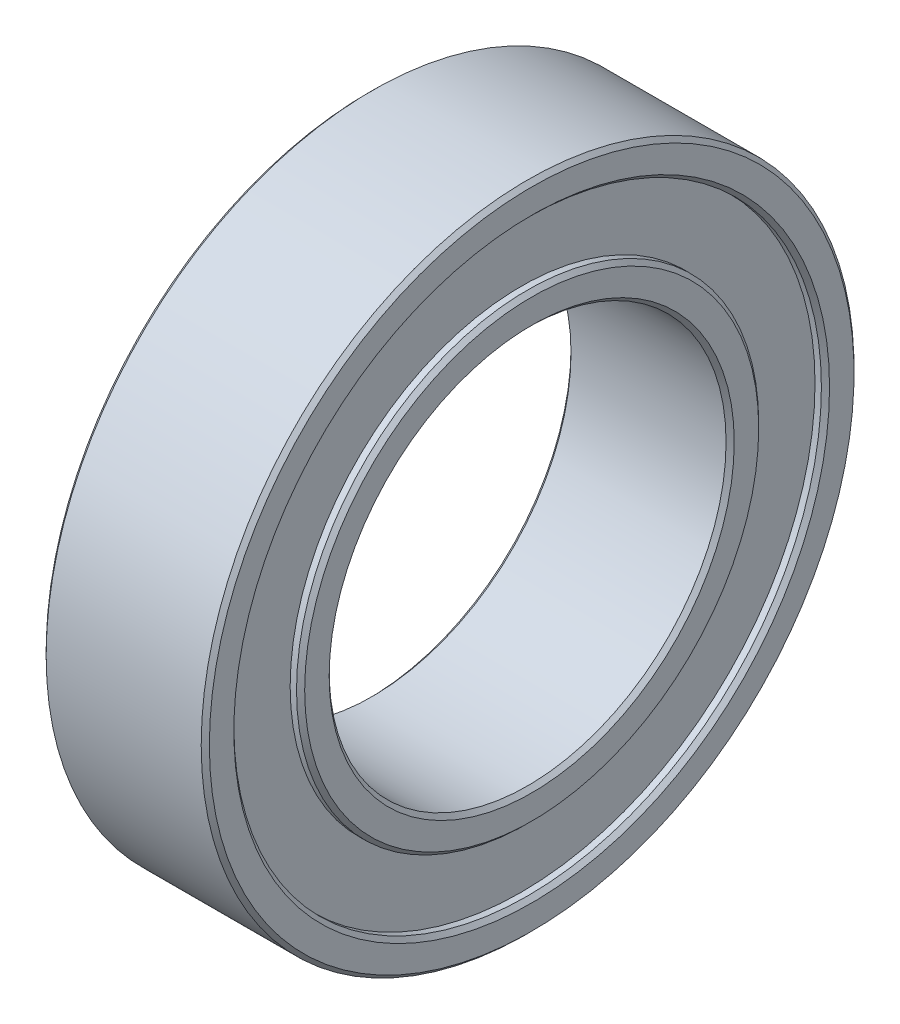
ISO-10303-21;
HEADER;
FILE_DESCRIPTION(('STEP AP214'),'2;1');
FILE_NAME('part.step','',(''),(''),'','','');
FILE_SCHEMA(('AUTOMOTIVE_DESIGN { 1 0 10303 214 1 1 1 1 }'));
ENDSEC;
DATA;
#1=APPLICATION_CONTEXT('core data for automotive mechanical design processes');
#2=APPLICATION_PROTOCOL_DEFINITION('international standard','automotive_design',2000,#1);
#3=PRODUCT_CONTEXT('',#1,'mechanical');
#4=PRODUCT('Part','Part','',(#3));
#5=PRODUCT_RELATED_PRODUCT_CATEGORY('part','',(#4));
#6=PRODUCT_DEFINITION_FORMATION('','',#4);
#7=PRODUCT_DEFINITION_CONTEXT('part definition',#1,'design');
#8=PRODUCT_DEFINITION('design','',#6,#7);
#9=PRODUCT_DEFINITION_SHAPE('','',#8);
#10=(LENGTH_UNIT() NAMED_UNIT(*) SI_UNIT(.MILLI.,.METRE.));
#11=(NAMED_UNIT(*) PLANE_ANGLE_UNIT() SI_UNIT($,.RADIAN.));
#12=(NAMED_UNIT(*) SI_UNIT($,.STERADIAN.) SOLID_ANGLE_UNIT());
#13=UNCERTAINTY_MEASURE_WITH_UNIT(LENGTH_MEASURE(1.E-05),#10,'distance_accuracy_value','');
#14=(GEOMETRIC_REPRESENTATION_CONTEXT(3) GLOBAL_UNCERTAINTY_ASSIGNED_CONTEXT((#13)) GLOBAL_UNIT_ASSIGNED_CONTEXT((#10,
#11,#12)) REPRESENTATION_CONTEXT('',''));
#15=CARTESIAN_POINT('',(0.,0.,0.));
#16=DIRECTION('',(0.,0.,1.));
#17=DIRECTION('',(1.,0.,0.));
#18=AXIS2_PLACEMENT_3D('',#15,#16,#17);
#19=CARTESIAN_POINT('',(1.984375,0.,0.));
#20=DIRECTION('',(-1.,0.,0.));
#21=DIRECTION('',(0.,0.,1.));
#22=AXIS2_PLACEMENT_3D('',#19,#20,#21);
#23=CYLINDRICAL_SURFACE('',#22,5.61975);
#24=CARTESIAN_POINT('',(-1.984375,0.,0.));
#25=DIRECTION('',(1.,0.,0.));
#26=DIRECTION('',(0.,0.,-1.));
#27=AXIS2_PLACEMENT_3D('',#24,#25,#26);
#28=CIRCLE('',#27,5.61975);
#29=CARTESIAN_POINT('',(-1.984375,0.,-5.61975));
#30=VERTEX_POINT('',#29);
#31=EDGE_CURVE('E99',#30,#30,#28,.T.);
#32=ORIENTED_EDGE('',*,*,#31,.T.);
#33=EDGE_LOOP('',(#32));
#34=FACE_BOUND('',#33,.T.);
#35=CARTESIAN_POINT('',(-1.730375,0.,0.));
#36=DIRECTION('',(1.,0.,0.));
#37=DIRECTION('',(0.,0.,-1.));
#38=AXIS2_PLACEMENT_3D('',#35,#36,#37);
#39=CIRCLE('',#38,5.61975);
#40=CARTESIAN_POINT('',(-1.730375,0.,-5.61975));
#41=VERTEX_POINT('',#40);
#42=EDGE_CURVE('E96',#41,#41,#39,.T.);
#43=ORIENTED_EDGE('',*,*,#42,.F.);
#44=EDGE_LOOP('',(#43));
#45=FACE_BOUND('',#44,.T.);
#46=ADVANCED_FACE('F51',(#34,#45),#23,.T.);
#47=CARTESIAN_POINT('',(1.984375,0.,0.));
#48=DIRECTION('',(-1.,0.,0.));
#49=DIRECTION('',(0.,0.,1.));
#50=AXIS2_PLACEMENT_3D('',#47,#48,#49);
#51=CYLINDRICAL_SURFACE('',#50,4.826);
#52=CARTESIAN_POINT('',(-1.88515625,0.,0.));
#53=DIRECTION('',(1.,0.,0.));
#54=DIRECTION('',(0.,0.,-1.));
#55=AXIS2_PLACEMENT_3D('',#52,#53,#54);
#56=CIRCLE('',#55,4.826);
#57=CARTESIAN_POINT('',(-1.88515625,0.,-4.826));
#58=VERTEX_POINT('',#57);
#59=EDGE_CURVE('E87',#58,#58,#56,.F.);
#60=ORIENTED_EDGE('',*,*,#59,.T.);
#61=EDGE_LOOP('',(#60));
#62=FACE_BOUND('',#61,.T.);
#63=CARTESIAN_POINT('',(1.88515625,0.,0.));
#64=DIRECTION('',(1.,0.,0.));
#65=DIRECTION('',(0.,0.,-1.));
#66=AXIS2_PLACEMENT_3D('',#63,#64,#65);
#67=CIRCLE('',#66,4.826);
#68=CARTESIAN_POINT('',(1.88515625,0.,-4.826));
#69=VERTEX_POINT('',#68);
#70=EDGE_CURVE('E90',#69,#69,#67,.T.);
#71=ORIENTED_EDGE('',*,*,#70,.T.);
#72=EDGE_LOOP('',(#71));
#73=FACE_BOUND('',#72,.T.);
#74=ADVANCED_FACE('F132',(#62,#73),#51,.F.);
#75=CARTESIAN_POINT('',(1.88515625,0.,0.));
#76=DIRECTION('',(1.,0.,0.));
#77=DIRECTION('',(0.,0.,-1.));
#78=AXIS2_PLACEMENT_3D('',#75,#76,#77);
#79=CIRCLE('',#78,5.61975);
#80=CARTESIAN_POINT('',(1.88515625,0.,-5.61975));
#81=VERTEX_POINT('',#80);
#82=EDGE_CURVE('E11',#81,#81,#79,.F.);
#83=ORIENTED_EDGE('',*,*,#82,.T.);
#84=EDGE_LOOP('',(#83));
#85=FACE_BOUND('',#84,.T.);
#86=CARTESIAN_POINT('',(1.730375,0.,0.));
#87=DIRECTION('',(1.,0.,0.));
#88=DIRECTION('',(0.,0.,-1.));
#89=AXIS2_PLACEMENT_3D('',#86,#87,#88);
#90=CIRCLE('',#89,5.61975);
#91=CARTESIAN_POINT('',(1.730375,0.,-5.61975));
#92=VERTEX_POINT('',#91);
#93=EDGE_CURVE('E105',#92,#92,#90,.T.);
#94=ORIENTED_EDGE('',*,*,#93,.T.);
#95=EDGE_LOOP('',(#94));
#96=FACE_BOUND('',#95,.T.);
#97=ADVANCED_FACE('F135',(#85,#96),#23,.T.);
#98=CARTESIAN_POINT('',(1.984375,0.,0.));
#99=DIRECTION('',(1.,0.,0.));
#100=DIRECTION('',(0.,0.,-1.));
#101=AXIS2_PLACEMENT_3D('',#98,#99,#100);
#102=PLANE('',#101);
#103=CARTESIAN_POINT('',(1.984375,0.,0.));
#104=DIRECTION('',(1.,0.,0.));
#105=DIRECTION('',(0.,0.,-1.));
#106=AXIS2_PLACEMENT_3D('',#103,#104,#105);
#107=CIRCLE('',#106,4.92521875);
#108=CARTESIAN_POINT('',(1.984375,0.,-4.92521875));
#109=VERTEX_POINT('',#108);
#110=EDGE_CURVE('E81',#109,#109,#107,.F.);
#111=ORIENTED_EDGE('',*,*,#110,.T.);
#112=EDGE_LOOP('',(#111));
#113=FACE_BOUND('',#112,.T.);
#114=CARTESIAN_POINT('',(1.984375,0.,0.));
#115=DIRECTION('',(1.,0.,0.));
#116=DIRECTION('',(0.,0.,-1.));
#117=AXIS2_PLACEMENT_3D('',#114,#115,#116);
#118=CIRCLE('',#117,5.52053125);
#119=CARTESIAN_POINT('',(1.984375,0.,-5.52053125));
#120=VERTEX_POINT('',#119);
#121=EDGE_CURVE('E84',#120,#120,#118,.T.);
#122=ORIENTED_EDGE('',*,*,#121,.T.);
#123=EDGE_LOOP('',(#122));
#124=FACE_BOUND('',#123,.T.);
#125=ADVANCED_FACE('F144',(#113,#124),#102,.T.);
#126=CARTESIAN_POINT('',(-1.984375,0.,0.));
#127=DIRECTION('',(1.,0.,0.));
#128=DIRECTION('',(0.,0.,-1.));
#129=AXIS2_PLACEMENT_3D('',#126,#127,#128);
#130=PLANE('',#129);
#131=CARTESIAN_POINT('',(-1.984375,0.,0.));
#132=DIRECTION('',(1.,0.,0.));
#133=DIRECTION('',(0.,0.,-1.));
#134=AXIS2_PLACEMENT_3D('',#131,#132,#133);
#135=CIRCLE('',#134,4.92521875);
#136=CARTESIAN_POINT('',(-1.984375,0.,-4.92521875));
#137=VERTEX_POINT('',#136);
#138=EDGE_CURVE('E93',#137,#137,#135,.T.);
#139=ORIENTED_EDGE('',*,*,#138,.T.);
#140=EDGE_LOOP('',(#139));
#141=FACE_BOUND('',#140,.T.);
#142=ORIENTED_EDGE('',*,*,#31,.F.);
#143=EDGE_LOOP('',(#142));
#144=FACE_BOUND('',#143,.T.);
#145=ADVANCED_FACE('F148',(#141,#144),#130,.F.);
#146=CARTESIAN_POINT('',(1.730375,0.,0.));
#147=DIRECTION('',(1.,0.,0.));
#148=DIRECTION('',(0.,0.,-1.));
#149=AXIS2_PLACEMENT_3D('',#146,#147,#148);
#150=PLANE('',#149);
#151=CARTESIAN_POINT('',(1.730375,0.,0.));
#152=DIRECTION('',(1.,0.,0.));
#153=DIRECTION('',(0.,0.,-1.));
#154=AXIS2_PLACEMENT_3D('',#151,#152,#153);
#155=CIRCLE('',#154,7.14375);
#156=CARTESIAN_POINT('',(1.730375,0.,-7.14375));
#157=VERTEX_POINT('',#156);
#158=EDGE_CURVE('E108',#157,#157,#155,.F.);
#159=ORIENTED_EDGE('',*,*,#158,.F.);
#160=EDGE_LOOP('',(#159));
#161=FACE_BOUND('',#160,.T.);
#162=ORIENTED_EDGE('',*,*,#93,.F.);
#163=EDGE_LOOP('',(#162));
#164=FACE_BOUND('',#163,.T.);
#165=ADVANCED_FACE('F127',(#161,#164),#150,.T.);
#166=CARTESIAN_POINT('',(-1.730375,0.,0.));
#167=DIRECTION('',(1.,0.,0.));
#168=DIRECTION('',(0.,0.,-1.));
#169=AXIS2_PLACEMENT_3D('',#166,#167,#168);
#170=PLANE('',#169);
#171=CARTESIAN_POINT('',(-1.730375,0.,0.));
#172=DIRECTION('',(1.,0.,0.));
#173=DIRECTION('',(0.,0.,-1.));
#174=AXIS2_PLACEMENT_3D('',#171,#172,#173);
#175=CIRCLE('',#174,7.14375);
#176=CARTESIAN_POINT('',(-1.730375,0.,-7.14375));
#177=VERTEX_POINT('',#176);
#178=EDGE_CURVE('E102',#177,#177,#175,.T.);
#179=ORIENTED_EDGE('',*,*,#178,.F.);
#180=EDGE_LOOP('',(#179));
#181=FACE_BOUND('',#180,.T.);
#182=ORIENTED_EDGE('',*,*,#42,.T.);
#183=EDGE_LOOP('',(#182));
#184=FACE_BOUND('',#183,.T.);
#185=ADVANCED_FACE('F121',(#181,#184),#170,.F.);
#186=CARTESIAN_POINT('',(1.984375,0.,0.));
#187=DIRECTION('',(-1.,0.,0.));
#188=DIRECTION('',(0.,0.,1.));
#189=AXIS2_PLACEMENT_3D('',#186,#187,#188);
#190=CYLINDRICAL_SURFACE('',#189,7.14375);
#191=CARTESIAN_POINT('',(-1.984375,0.,0.));
#192=DIRECTION('',(1.,0.,0.));
#193=DIRECTION('',(0.,0.,-1.));
#194=AXIS2_PLACEMENT_3D('',#191,#192,#193);
#195=CIRCLE('',#194,7.14375);
#196=CARTESIAN_POINT('',(-1.984375,0.,-7.14375));
#197=VERTEX_POINT('',#196);
#198=EDGE_CURVE('E111',#197,#197,#195,.T.);
#199=ORIENTED_EDGE('',*,*,#198,.F.);
#200=EDGE_LOOP('',(#199));
#201=FACE_BOUND('',#200,.T.);
#202=ORIENTED_EDGE('',*,*,#178,.T.);
#203=EDGE_LOOP('',(#202));
#204=FACE_BOUND('',#203,.T.);
#205=ADVANCED_FACE('F117',(#201,#204),#190,.F.);
#206=CARTESIAN_POINT('',(1.88515625,0.,0.));
#207=DIRECTION('',(1.,0.,0.));
#208=DIRECTION('',(0.,0.,-1.));
#209=AXIS2_PLACEMENT_3D('',#206,#207,#208);
#210=CIRCLE('',#209,7.14375);
#211=CARTESIAN_POINT('',(1.88515625,0.,-7.14375));
#212=VERTEX_POINT('',#211);
#213=EDGE_CURVE('E59',#212,#212,#210,.T.);
#214=ORIENTED_EDGE('',*,*,#213,.T.);
#215=EDGE_LOOP('',(#214));
#216=FACE_BOUND('',#215,.T.);
#217=ORIENTED_EDGE('',*,*,#158,.T.);
#218=EDGE_LOOP('',(#217));
#219=FACE_BOUND('',#218,.T.);
#220=ADVANCED_FACE('F120',(#216,#219),#190,.F.);
#221=CARTESIAN_POINT('',(1.984375,0.,0.));
#222=DIRECTION('',(-1.,0.,0.));
#223=DIRECTION('',(0.,0.,1.));
#224=AXIS2_PLACEMENT_3D('',#221,#222,#223);
#225=CYLINDRICAL_SURFACE('',#224,7.9375);
#226=CARTESIAN_POINT('',(-1.88515625,0.,0.));
#227=DIRECTION('',(1.,0.,0.));
#228=DIRECTION('',(0.,0.,-1.));
#229=AXIS2_PLACEMENT_3D('',#226,#227,#228);
#230=CIRCLE('',#229,7.9375);
#231=CARTESIAN_POINT('',(-1.88515625,0.,-7.9375));
#232=VERTEX_POINT('',#231);
#233=EDGE_CURVE('E75',#232,#232,#230,.T.);
#234=ORIENTED_EDGE('',*,*,#233,.T.);
#235=EDGE_LOOP('',(#234));
#236=FACE_BOUND('',#235,.T.);
#237=CARTESIAN_POINT('',(1.88515625000001,0.,0.));
#238=DIRECTION('',(1.,0.,0.));
#239=DIRECTION('',(0.,0.,-1.));
#240=AXIS2_PLACEMENT_3D('',#237,#238,#239);
#241=CIRCLE('',#240,7.9375);
#242=CARTESIAN_POINT('',(1.88515625000001,0.,7.9375));
#243=VERTEX_POINT('',#242);
#244=EDGE_CURVE('E78',#243,#243,#241,.F.);
#245=ORIENTED_EDGE('',*,*,#244,.T.);
#246=EDGE_LOOP('',(#245));
#247=FACE_BOUND('',#246,.T.);
#248=ADVANCED_FACE('F164',(#236,#247),#225,.T.);
#249=CARTESIAN_POINT('',(1.984375,0.,0.));
#250=DIRECTION('',(1.,0.,0.));
#251=DIRECTION('',(0.,0.,-1.));
#252=AXIS2_PLACEMENT_3D('',#249,#250,#251);
#253=PLANE('',#252);
#254=CARTESIAN_POINT('',(1.984375,0.,0.));
#255=DIRECTION('',(1.,0.,0.));
#256=DIRECTION('',(0.,0.,-1.));
#257=AXIS2_PLACEMENT_3D('',#254,#255,#256);
#258=CIRCLE('',#257,7.83828125000001);
#259=CARTESIAN_POINT('',(1.984375,0.,7.83828125000001));
#260=VERTEX_POINT('',#259);
#261=EDGE_CURVE('E63',#260,#260,#258,.T.);
#262=ORIENTED_EDGE('',*,*,#261,.T.);
#263=EDGE_LOOP('',(#262));
#264=FACE_BOUND('',#263,.T.);
#265=CARTESIAN_POINT('',(1.984375,0.,0.));
#266=DIRECTION('',(1.,0.,0.));
#267=DIRECTION('',(0.,0.,-1.));
#268=AXIS2_PLACEMENT_3D('',#265,#266,#267);
#269=CIRCLE('',#268,7.24296875);
#270=CARTESIAN_POINT('',(1.984375,0.,-7.24296875));
#271=VERTEX_POINT('',#270);
#272=EDGE_CURVE('E67',#271,#271,#269,.F.);
#273=ORIENTED_EDGE('',*,*,#272,.T.);
#274=EDGE_LOOP('',(#273));
#275=FACE_BOUND('',#274,.T.);
#276=ADVANCED_FACE('F167',(#264,#275),#253,.T.);
#277=CARTESIAN_POINT('',(-1.984375,0.,0.));
#278=DIRECTION('',(1.,0.,0.));
#279=DIRECTION('',(0.,0.,-1.));
#280=AXIS2_PLACEMENT_3D('',#277,#278,#279);
#281=PLANE('',#280);
#282=CARTESIAN_POINT('',(-1.984375,0.,0.));
#283=DIRECTION('',(1.,0.,0.));
#284=DIRECTION('',(0.,0.,-1.));
#285=AXIS2_PLACEMENT_3D('',#282,#283,#284);
#286=CIRCLE('',#285,7.83828125);
#287=CARTESIAN_POINT('',(-1.984375,0.,-7.83828125));
#288=VERTEX_POINT('',#287);
#289=EDGE_CURVE('E72',#288,#288,#286,.F.);
#290=ORIENTED_EDGE('',*,*,#289,.T.);
#291=EDGE_LOOP('',(#290));
#292=FACE_BOUND('',#291,.T.);
#293=ORIENTED_EDGE('',*,*,#198,.T.);
#294=EDGE_LOOP('',(#293));
#295=FACE_BOUND('',#294,.T.);
#296=ADVANCED_FACE('F115',(#292,#295),#281,.F.);
#297=CARTESIAN_POINT('',(-1.984375,0.,0.));
#298=DIRECTION('',(-1.,0.,0.));
#299=DIRECTION('',(0.,0.,1.));
#300=AXIS2_PLACEMENT_3D('',#297,#298,#299);
#301=CONICAL_SURFACE('',#300,4.92521875,0.785398163397444);
#302=ORIENTED_EDGE('',*,*,#59,.F.);
#303=EDGE_LOOP('',(#302));
#304=FACE_BOUND('',#303,.T.);
#305=ORIENTED_EDGE('',*,*,#138,.F.);
#306=EDGE_LOOP('',(#305));
#307=FACE_BOUND('',#306,.T.);
#308=ADVANCED_FACE('F171',(#304,#307),#301,.F.);
#309=CARTESIAN_POINT('',(1.88515625,0.,0.));
#310=DIRECTION('',(1.,0.,0.));
#311=DIRECTION('',(0.,0.,-1.));
#312=AXIS2_PLACEMENT_3D('',#309,#310,#311);
#313=CONICAL_SURFACE('',#312,4.826,0.785398163397461);
#314=ORIENTED_EDGE('',*,*,#110,.F.);
#315=EDGE_LOOP('',(#314));
#316=FACE_BOUND('',#315,.T.);
#317=ORIENTED_EDGE('',*,*,#70,.F.);
#318=EDGE_LOOP('',(#317));
#319=FACE_BOUND('',#318,.T.);
#320=ADVANCED_FACE('F206',(#316,#319),#313,.F.);
#321=CARTESIAN_POINT('',(-1.88515625,0.,0.));
#322=DIRECTION('',(1.,0.,0.));
#323=DIRECTION('',(0.,0.,-1.));
#324=AXIS2_PLACEMENT_3D('',#321,#322,#323);
#325=CONICAL_SURFACE('',#324,7.9375,0.785398163397448);
#326=ORIENTED_EDGE('',*,*,#289,.F.);
#327=EDGE_LOOP('',(#326));
#328=FACE_BOUND('',#327,.T.);
#329=ORIENTED_EDGE('',*,*,#233,.F.);
#330=EDGE_LOOP('',(#329));
#331=FACE_BOUND('',#330,.T.);
#332=ADVANCED_FACE('F190',(#328,#331),#325,.T.);
#333=CARTESIAN_POINT('',(1.984375,0.,0.));
#334=DIRECTION('',(-1.,0.,0.));
#335=DIRECTION('',(0.,0.,1.));
#336=AXIS2_PLACEMENT_3D('',#333,#334,#335);
#337=CONICAL_SURFACE('',#336,7.83828125000001,0.785398163397448);
#338=CARTESIAN_POINT('',(1.88515625000001,0.,7.9375));
#339=CARTESIAN_POINT('',(1.88618977864584,0.,7.93646647135417));
#340=CARTESIAN_POINT('',(1.88722330729167,0.,7.93543294270833));
#341=CARTESIAN_POINT('',(1.88929036458334,0.,7.93336588541667));
#342=CARTESIAN_POINT('',(1.89032389322917,0.,7.93233235677083));
#343=CARTESIAN_POINT('',(1.89239095052084,0.,7.93026529947917));
#344=CARTESIAN_POINT('',(1.89342447916667,0.,7.92923177083333));
#345=CARTESIAN_POINT('',(1.89549153645834,0.,7.92716471354167));
#346=CARTESIAN_POINT('',(1.89652506510417,0.,7.92613118489583));
#347=CARTESIAN_POINT('',(1.89859212239584,0.,7.92406412760417));
#348=CARTESIAN_POINT('',(1.89962565104167,0.,7.92303059895833));
#349=CARTESIAN_POINT('',(1.90169270833334,0.,7.92096354166667));
#350=CARTESIAN_POINT('',(1.90272623697917,0.,7.91993001302083));
#351=CARTESIAN_POINT('',(1.90479329427084,0.,7.91786295572917));
#352=CARTESIAN_POINT('',(1.90582682291667,0.,7.91682942708333));
#353=CARTESIAN_POINT('',(1.90789388020834,0.,7.91476236979167));
#354=CARTESIAN_POINT('',(1.90892740885417,0.,7.91372884114584));
#355=CARTESIAN_POINT('',(1.91099446614584,0.,7.91166178385417));
#356=CARTESIAN_POINT('',(1.91202799479167,0.,7.91062825520833));
#357=CARTESIAN_POINT('',(1.91409505208334,0.,7.90856119791667));
#358=CARTESIAN_POINT('',(1.91512858072917,0.,7.90752766927083));
#359=CARTESIAN_POINT('',(1.91719563802084,0.,7.90546061197917));
#360=CARTESIAN_POINT('',(1.91822916666667,0.,7.90442708333333));
#361=CARTESIAN_POINT('',(1.92029622395834,0.,7.90236002604167));
#362=CARTESIAN_POINT('',(1.92132975260417,0.,7.90132649739583));
#363=CARTESIAN_POINT('',(1.92339680989584,0.,7.89925944010417));
#364=CARTESIAN_POINT('',(1.92443033854167,0.,7.89822591145834));
#365=CARTESIAN_POINT('',(1.92649739583334,0.,7.89615885416667));
#366=CARTESIAN_POINT('',(1.92753092447917,0.,7.89512532552084));
#367=CARTESIAN_POINT('',(1.92959798177084,0.,7.89305826822917));
#368=CARTESIAN_POINT('',(1.93063151041667,0.,7.89202473958334));
#369=CARTESIAN_POINT('',(1.93269856770834,0.,7.88995768229167));
#370=CARTESIAN_POINT('',(1.93373209635417,0.,7.88892415364584));
#371=CARTESIAN_POINT('',(1.93579915364584,0.,7.88685709635417));
#372=CARTESIAN_POINT('',(1.93683268229167,0.,7.88582356770834));
#373=CARTESIAN_POINT('',(1.93889973958334,0.,7.88375651041667));
#374=CARTESIAN_POINT('',(1.93993326822917,0.,7.88272298177084));
#375=CARTESIAN_POINT('',(1.94200032552084,0.,7.88065592447917));
#376=CARTESIAN_POINT('',(1.94303385416667,0.,7.87962239583334));
#377=CARTESIAN_POINT('',(1.94510091145834,0.,7.87755533854167));
#378=CARTESIAN_POINT('',(1.94613444010417,0.,7.87652180989584));
#379=CARTESIAN_POINT('',(1.94820149739584,0.,7.87445475260417));
#380=CARTESIAN_POINT('',(1.94923502604167,0.,7.87342122395834));
#381=CARTESIAN_POINT('',(1.95130208333333,0.,7.87135416666667));
#382=CARTESIAN_POINT('',(1.95233561197917,0.,7.87032063802084));
#383=CARTESIAN_POINT('',(1.95440266927083,0.,7.86825358072917));
#384=CARTESIAN_POINT('',(1.95543619791667,0.,7.86722005208334));
#385=CARTESIAN_POINT('',(1.95750325520833,0.,7.86515299479167));
#386=CARTESIAN_POINT('',(1.95853678385417,0.,7.86411946614584));
#387=CARTESIAN_POINT('',(1.96060384114583,0.,7.86205240885417));
#388=CARTESIAN_POINT('',(1.96163736979167,0.,7.86101888020834));
#389=CARTESIAN_POINT('',(1.96370442708333,0.,7.85895182291667));
#390=CARTESIAN_POINT('',(1.96473795572917,0.,7.85791829427084));
#391=CARTESIAN_POINT('',(1.96680501302083,0.,7.85585123697917));
#392=CARTESIAN_POINT('',(1.96783854166667,0.,7.85481770833334));
#393=CARTESIAN_POINT('',(1.96990559895833,0.,7.85275065104167));
#394=CARTESIAN_POINT('',(1.97093912760417,0.,7.85171712239584));
#395=CARTESIAN_POINT('',(1.97300618489583,0.,7.84965006510417));
#396=CARTESIAN_POINT('',(1.97403971354167,0.,7.84861653645834));
#397=CARTESIAN_POINT('',(1.97610677083333,0.,7.84654947916667));
#398=CARTESIAN_POINT('',(1.97714029947917,0.,7.84551595052084));
#399=CARTESIAN_POINT('',(1.97920735677083,0.,7.84344889322917));
#400=CARTESIAN_POINT('',(1.98024088541667,0.,7.84241536458334));
#401=CARTESIAN_POINT('',(1.98230794270833,0.,7.84034830729167));
#402=CARTESIAN_POINT('',(1.98334147135417,0.,7.83931477864584));
#403=CARTESIAN_POINT('',(1.984375,0.,7.83828125000001));
#404=B_SPLINE_CURVE_WITH_KNOTS('',3,(#338,#339,#340,#341,#342,#343,#344,#345,#346,#347,#348,
#349,#350,#351,#352,#353,#354,#355,#356,#357,#358,#359,#360,#361,#362,#363,#364,#365,#366,#367,
#368,#369,#370,#371,#372,#373,#374,#375,#376,#377,#378,#379,#380,#381,#382,#383,#384,#385,#386,
#387,#388,#389,#390,#391,#392,#393,#394,#395,#396,#397,#398,#399,#400,#401,#402,#403),
.UNSPECIFIED.,.F.,.F.,(4,2,2,2,2,2,2,2,2,2,2,2,2,2,2,2,2,2,2,2,2,2,2,2,2,2,2,2,2,2,2,2,4),(0.,
0.00438489068411493,0.00876978136823094,0.0131546720523471,0.0175395627364619,0.021924453420578,
0.0263093441046928,0.030694234788809,0.0350791254729237,0.0394640161570399,0.0438489068411559,
0.0482337975252708,0.0526186882093868,0.0570035788935018,0.0613884695776178,0.0657733602617327,
0.0701582509458487,0.0745431416299637,0.0789280323140797,0.0833129229981958,0.0876978136823106,
0.0920827043664268,0.0964675950505415,0.100852485734658,0.105237376418773,0.109622267102889,
0.114007157787005,0.118392048471119,0.122776939155236,0.127161829839351,0.131546720523467,
0.135931611207581,0.140316501891698),.UNSPECIFIED.);
#405=EDGE_CURVE('BSEAM184',#243,#260,#404,.T.);
#406=ORIENTED_EDGE('',*,*,#244,.F.);
#407=ORIENTED_EDGE('',*,*,#261,.F.);
#408=ORIENTED_EDGE('',*,*,#405,.T.);
#409=ORIENTED_EDGE('',*,*,#405,.F.);
#410=EDGE_LOOP('',(#406,#408,#407,#409));
#411=FACE_BOUND('',#410,.T.);
#412=ADVANCED_FACE('F184',(#411),#337,.T.);
#413=CARTESIAN_POINT('',(1.88515625,0.,0.));
#414=DIRECTION('',(1.,0.,0.));
#415=DIRECTION('',(0.,0.,-1.));
#416=AXIS2_PLACEMENT_3D('',#413,#414,#415);
#417=CONICAL_SURFACE('',#416,7.14375,0.785398163397461);
#418=ORIENTED_EDGE('',*,*,#272,.F.);
#419=EDGE_LOOP('',(#418));
#420=FACE_BOUND('',#419,.T.);
#421=ORIENTED_EDGE('',*,*,#213,.F.);
#422=EDGE_LOOP('',(#421));
#423=FACE_BOUND('',#422,.T.);
#424=ADVANCED_FACE('F181',(#420,#423),#417,.F.);
#425=CARTESIAN_POINT('',(1.984375,0.,0.));
#426=DIRECTION('',(-1.,0.,0.));
#427=DIRECTION('',(0.,0.,1.));
#428=AXIS2_PLACEMENT_3D('',#425,#426,#427);
#429=CONICAL_SURFACE('',#428,5.52053125,0.78539816339744);
#430=ORIENTED_EDGE('',*,*,#82,.F.);
#431=EDGE_LOOP('',(#430));
#432=FACE_BOUND('',#431,.T.);
#433=ORIENTED_EDGE('',*,*,#121,.F.);
#434=EDGE_LOOP('',(#433));
#435=FACE_BOUND('',#434,.T.);
#436=ADVANCED_FACE('F54',(#432,#435),#429,.T.);
#437=CLOSED_SHELL('',(#46,#74,#97,#125,#145,#165,#185,#205,#220,#248,#276,#296,#308,#320,#332,
#412,#424,#436));
#438=MANIFOLD_SOLID_BREP('B2',#437);
#439=ADVANCED_BREP_SHAPE_REPRESENTATION('',(#18,#438),#14);
#440=SHAPE_DEFINITION_REPRESENTATION(#9,#439);
ENDSEC;
END-ISO-10303-21;
